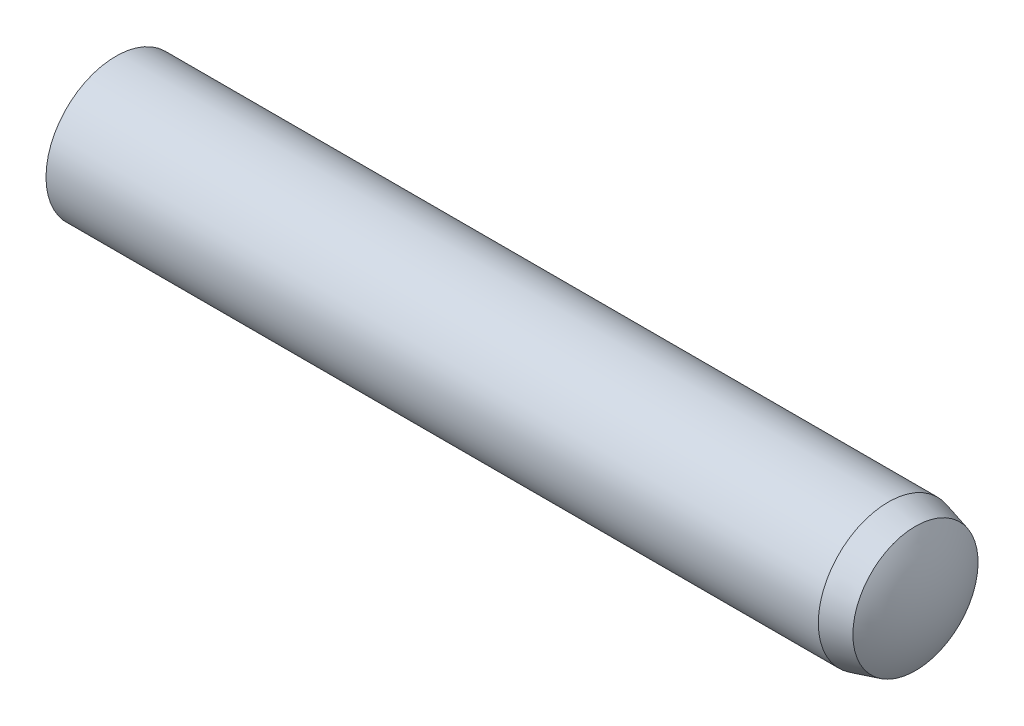
ISO-10303-21;
HEADER;
FILE_DESCRIPTION(('STEP AP214'),'2;1');
FILE_NAME('part.step','',(''),(''),'','','');
FILE_SCHEMA(('AUTOMOTIVE_DESIGN { 1 0 10303 214 1 1 1 1 }'));
ENDSEC;
DATA;
#1=APPLICATION_CONTEXT('core data for automotive mechanical design processes');
#2=APPLICATION_PROTOCOL_DEFINITION('international standard','automotive_design',2000,#1);
#3=PRODUCT_CONTEXT('',#1,'mechanical');
#4=PRODUCT('Part','Part','',(#3));
#5=PRODUCT_RELATED_PRODUCT_CATEGORY('part','',(#4));
#6=PRODUCT_DEFINITION_FORMATION('','',#4);
#7=PRODUCT_DEFINITION_CONTEXT('part definition',#1,'design');
#8=PRODUCT_DEFINITION('design','',#6,#7);
#9=PRODUCT_DEFINITION_SHAPE('','',#8);
#10=(LENGTH_UNIT() NAMED_UNIT(*) SI_UNIT(.MILLI.,.METRE.));
#11=(NAMED_UNIT(*) PLANE_ANGLE_UNIT() SI_UNIT($,.RADIAN.));
#12=(NAMED_UNIT(*) SI_UNIT($,.STERADIAN.) SOLID_ANGLE_UNIT());
#13=UNCERTAINTY_MEASURE_WITH_UNIT(LENGTH_MEASURE(1.E-05),#10,'distance_accuracy_value','');
#14=(GEOMETRIC_REPRESENTATION_CONTEXT(3) GLOBAL_UNCERTAINTY_ASSIGNED_CONTEXT((#13)) GLOBAL_UNIT_ASSIGNED_CONTEXT((#10,
#11,#12)) REPRESENTATION_CONTEXT('',''));
#15=CARTESIAN_POINT('',(0.,0.,0.));
#16=DIRECTION('',(0.,0.,1.));
#17=DIRECTION('',(1.,0.,0.));
#18=AXIS2_PLACEMENT_3D('',#15,#16,#17);
#19=CARTESIAN_POINT('',(-6.,0.,0.));
#20=DIRECTION('',(1.,0.,0.));
#21=DIRECTION('',(0.,0.,-1.));
#22=AXIS2_PLACEMENT_3D('',#19,#20,#21);
#23=CYLINDRICAL_SURFACE('',#22,0.999999999999999);
#24=CARTESIAN_POINT('',(5.35,0.,0.));
#25=DIRECTION('',(-1.,0.,0.));
#26=DIRECTION('',(0.,0.,1.));
#27=AXIS2_PLACEMENT_3D('',#24,#25,#26);
#28=CIRCLE('',#27,0.999999999999992);
#29=CARTESIAN_POINT('',(5.35,0.,0.999999999999992));
#30=VERTEX_POINT('',#29);
#31=EDGE_CURVE('E11',#30,#30,#28,.T.);
#32=ORIENTED_EDGE('',*,*,#31,.T.);
#33=EDGE_LOOP('',(#32));
#34=FACE_BOUND('',#33,.T.);
#35=CARTESIAN_POINT('',(-5.7,0.,0.));
#36=DIRECTION('',(-1.,0.,0.));
#37=DIRECTION('',(0.,0.,1.));
#38=AXIS2_PLACEMENT_3D('',#35,#36,#37);
#39=CIRCLE('',#38,0.999999999999999);
#40=CARTESIAN_POINT('',(-5.7,0.,0.999999999999999));
#41=VERTEX_POINT('',#40);
#42=EDGE_CURVE('E52',#41,#41,#39,.T.);
#43=ORIENTED_EDGE('',*,*,#42,.F.);
#44=EDGE_LOOP('',(#43));
#45=FACE_BOUND('',#44,.T.);
#46=ADVANCED_FACE('F32',(#34,#45),#23,.T.);
#47=CARTESIAN_POINT('',(5.35,0.,0.));
#48=DIRECTION('',(-1.,0.,0.));
#49=DIRECTION('',(0.,0.,1.));
#50=AXIS2_PLACEMENT_3D('',#47,#48,#49);
#51=CONICAL_SURFACE('',#50,0.999999999999992,0.261799387799149);
#52=CARTESIAN_POINT('',(5.74,0.,0.));
#53=DIRECTION('',(-1.,0.,0.));
#54=DIRECTION('',(0.,0.,1.));
#55=AXIS2_PLACEMENT_3D('',#52,#53,#54);
#56=CIRCLE('',#55,0.895499814951855);
#57=CARTESIAN_POINT('',(5.74,0.,0.895499814951855));
#58=VERTEX_POINT('',#57);
#59=EDGE_CURVE('E39',#58,#58,#56,.T.);
#60=ORIENTED_EDGE('',*,*,#59,.T.);
#61=EDGE_LOOP('',(#60));
#62=FACE_BOUND('',#61,.T.);
#63=ORIENTED_EDGE('',*,*,#31,.F.);
#64=EDGE_LOOP('',(#63));
#65=FACE_BOUND('',#64,.T.);
#66=ADVANCED_FACE('F58',(#62,#65),#51,.T.);
#67=CARTESIAN_POINT('',(4.32784631042537,0.,0.));
#68=DIRECTION('',(-1.,0.,0.));
#69=DIRECTION('',(0.,1.,0.));
#70=AXIS2_PLACEMENT_3D('',#67,#68,#69);
#71=SPHERICAL_SURFACE('',#70,1.67215368957463);
#72=CARTESIAN_POINT('',(6.,0.,0.));
#73=VERTEX_POINT('',#72);
#74=VERTEX_LOOP('',#73);
#75=FACE_BOUND('',#74,.T.);
#76=ORIENTED_EDGE('',*,*,#59,.F.);
#77=EDGE_LOOP('',(#76));
#78=FACE_BOUND('',#77,.T.);
#79=ADVANCED_FACE('F48',(#75,#78),#71,.T.);
#80=CARTESIAN_POINT('',(-4.18333333333334,0.,0.));
#81=DIRECTION('',(-1.,0.,0.));
#82=DIRECTION('',(0.,-1.,0.));
#83=AXIS2_PLACEMENT_3D('',#80,#81,#82);
#84=SPHERICAL_SURFACE('',#83,1.81666666666666);
#85=CARTESIAN_POINT('',(-6.,0.,0.));
#86=VERTEX_POINT('',#85);
#87=VERTEX_LOOP('',#86);
#88=FACE_BOUND('',#87,.T.);
#89=ORIENTED_EDGE('',*,*,#42,.T.);
#90=EDGE_LOOP('',(#89));
#91=FACE_BOUND('',#90,.T.);
#92=ADVANCED_FACE('F45',(#88,#91),#84,.T.);
#93=CLOSED_SHELL('',(#46,#66,#79,#92));
#94=MANIFOLD_SOLID_BREP('B2',#93);
#95=ADVANCED_BREP_SHAPE_REPRESENTATION('',(#18,#94),#14);
#96=SHAPE_DEFINITION_REPRESENTATION(#9,#95);
ENDSEC;
END-ISO-10303-21;
